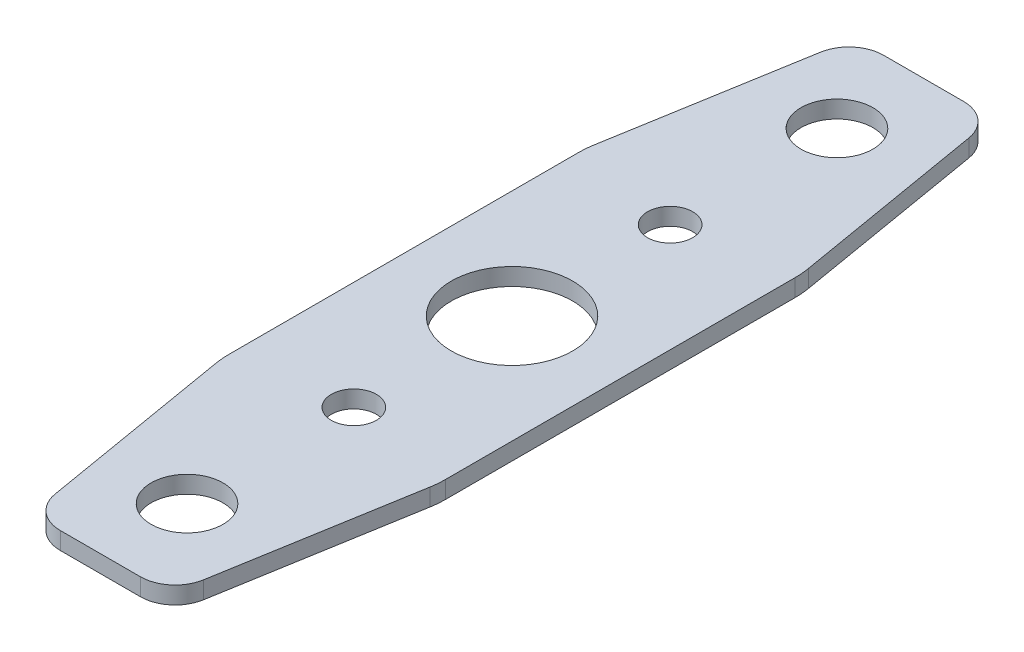
ISO-10303-21;
HEADER;
FILE_DESCRIPTION(('STEP AP214'),'2;1');
FILE_NAME('part.step','',(''),(''),'','','');
FILE_SCHEMA(('AUTOMOTIVE_DESIGN { 1 0 10303 214 1 1 1 1 }'));
ENDSEC;
DATA;
#1=APPLICATION_CONTEXT('core data for automotive mechanical design processes');
#2=APPLICATION_PROTOCOL_DEFINITION('international standard','automotive_design',2000,#1);
#3=PRODUCT_CONTEXT('',#1,'mechanical');
#4=PRODUCT('Part','Part','',(#3));
#5=PRODUCT_RELATED_PRODUCT_CATEGORY('part','',(#4));
#6=PRODUCT_DEFINITION_FORMATION('','',#4);
#7=PRODUCT_DEFINITION_CONTEXT('part definition',#1,'design');
#8=PRODUCT_DEFINITION('design','',#6,#7);
#9=PRODUCT_DEFINITION_SHAPE('','',#8);
#10=(LENGTH_UNIT() NAMED_UNIT(*) SI_UNIT(.MILLI.,.METRE.));
#11=(NAMED_UNIT(*) PLANE_ANGLE_UNIT() SI_UNIT($,.RADIAN.));
#12=(NAMED_UNIT(*) SI_UNIT($,.STERADIAN.) SOLID_ANGLE_UNIT());
#13=UNCERTAINTY_MEASURE_WITH_UNIT(LENGTH_MEASURE(1.E-05),#10,'distance_accuracy_value','');
#14=(GEOMETRIC_REPRESENTATION_CONTEXT(3) GLOBAL_UNCERTAINTY_ASSIGNED_CONTEXT((#13)) GLOBAL_UNIT_ASSIGNED_CONTEXT((#10,
#11,#12)) REPRESENTATION_CONTEXT('',''));
#15=CARTESIAN_POINT('',(0.,0.,0.));
#16=DIRECTION('',(0.,0.,1.));
#17=DIRECTION('',(1.,0.,0.));
#18=AXIS2_PLACEMENT_3D('',#15,#16,#17);
#19=CARTESIAN_POINT('',(4.62198337940662,2.,43.5));
#20=DIRECTION('',(0.,-1.,0.));
#21=DIRECTION('',(0.,0.,-1.));
#22=AXIS2_PLACEMENT_3D('',#19,#20,#21);
#23=CYLINDRICAL_SURFACE('',#22,4.);
#24=CARTESIAN_POINT('',(4.62198337940662,0.,43.5));
#25=DIRECTION('',(0.,1.,0.));
#26=DIRECTION('',(0.,0.,1.));
#27=AXIS2_PLACEMENT_3D('',#24,#25,#26);
#28=CIRCLE('',#27,4.);
#29=CARTESIAN_POINT('',(8.56552963796953,0.,44.1696587986239));
#30=VERTEX_POINT('',#29);
#31=CARTESIAN_POINT('',(4.62198337940661,0.,47.5));
#32=VERTEX_POINT('',#31);
#33=EDGE_CURVE('E156',#30,#32,#28,.F.);
#34=ORIENTED_EDGE('',*,*,#33,.F.);
#35=DIRECTION('',(0.,-1.,0.));
#36=VECTOR('',#35,1.);
#37=CARTESIAN_POINT('',(8.56552963796953,2.,44.1696587986239));
#38=LINE('',#37,#36);
#39=CARTESIAN_POINT('',(8.56552963796953,2.,44.1696587986239));
#40=VERTEX_POINT('',#39);
#41=EDGE_CURVE('E151',#40,#30,#38,.T.);
#42=ORIENTED_EDGE('',*,*,#41,.F.);
#43=CARTESIAN_POINT('',(4.62198337940662,2.,43.5));
#44=DIRECTION('',(0.,1.,0.));
#45=DIRECTION('',(0.,0.,1.));
#46=AXIS2_PLACEMENT_3D('',#43,#44,#45);
#47=CIRCLE('',#46,4.);
#48=CARTESIAN_POINT('',(4.62198337940661,2.,47.5));
#49=VERTEX_POINT('',#48);
#50=EDGE_CURVE('E154',#40,#49,#47,.F.);
#51=ORIENTED_EDGE('',*,*,#50,.T.);
#52=DIRECTION('',(0.,-1.,0.));
#53=VECTOR('',#52,1.);
#54=CARTESIAN_POINT('',(4.62198337940661,2.,47.5));
#55=LINE('',#54,#53);
#56=EDGE_CURVE('E218',#49,#32,#55,.T.);
#57=ORIENTED_EDGE('',*,*,#56,.T.);
#58=EDGE_LOOP('',(#34,#42,#51,#57));
#59=FACE_BOUND('',#58,.T.);
#60=ADVANCED_FACE('F35',(#59),#23,.T.);
#61=CARTESIAN_POINT('',(15.6157439446367,2.,2.65173010380624));
#62=DIRECTION('',(-0.98588656464073,0.,-0.167414699655973));
#63=DIRECTION('',(-0.167414699655973,0.,0.98588656464073));
#64=AXIS2_PLACEMENT_3D('',#61,#62,#63);
#65=PLANE('',#64);
#66=DIRECTION('',(0.167414699655973,0.,-0.98588656464073));
#67=VECTOR('',#66,1.);
#68=CARTESIAN_POINT('',(15.6157439446367,0.,2.65173010380624));
#69=LINE('',#68,#67);
#70=CARTESIAN_POINT('',(12.3588656464073,0.,21.8311245267126));
#71=VERTEX_POINT('',#70);
#72=EDGE_CURVE('E220',#30,#71,#69,.T.);
#73=ORIENTED_EDGE('',*,*,#72,.T.);
#74=DIRECTION('',(0.,-1.,0.));
#75=VECTOR('',#74,1.);
#76=CARTESIAN_POINT('',(12.3588656464073,2.,21.8311245267126));
#77=LINE('',#76,#75);
#78=CARTESIAN_POINT('',(12.3588656464073,2.,21.8311245267126));
#79=VERTEX_POINT('',#78);
#80=EDGE_CURVE('E43',#71,#79,#77,.F.);
#81=ORIENTED_EDGE('',*,*,#80,.T.);
#82=DIRECTION('',(0.167414699655973,0.,-0.98588656464073));
#83=VECTOR('',#82,1.);
#84=CARTESIAN_POINT('',(15.6157439446367,2.,2.65173010380624));
#85=LINE('',#84,#83);
#86=EDGE_CURVE('E164',#40,#79,#85,.T.);
#87=ORIENTED_EDGE('',*,*,#86,.F.);
#88=ORIENTED_EDGE('',*,*,#41,.T.);
#89=EDGE_LOOP('',(#73,#81,#87,#88));
#90=FACE_BOUND('',#89,.T.);
#91=ADVANCED_FACE('F165',(#90),#65,.F.);
#92=CARTESIAN_POINT('',(12.5,2.,0.));
#93=DIRECTION('',(-1.,0.,0.));
#94=DIRECTION('',(0.,0.,1.));
#95=AXIS2_PLACEMENT_3D('',#92,#93,#94);
#96=PLANE('',#95);
#97=DIRECTION('',(0.,0.,-1.));
#98=VECTOR('',#97,1.);
#99=CARTESIAN_POINT('',(12.5,2.,0.));
#100=LINE('',#99,#98);
#101=CARTESIAN_POINT('',(12.5,2.,20.1569775301528));
#102=VERTEX_POINT('',#101);
#103=CARTESIAN_POINT('',(12.5,2.,-20.1569775301528));
#104=VERTEX_POINT('',#103);
#105=EDGE_CURVE('E168',#102,#104,#100,.T.);
#106=ORIENTED_EDGE('',*,*,#105,.F.);
#107=DIRECTION('',(0.,-1.,0.));
#108=VECTOR('',#107,1.);
#109=CARTESIAN_POINT('',(12.5,2.,20.1569775301528));
#110=LINE('',#109,#108);
#111=CARTESIAN_POINT('',(12.5,0.,20.1569775301528));
#112=VERTEX_POINT('',#111);
#113=EDGE_CURVE('E300',#102,#112,#110,.T.);
#114=ORIENTED_EDGE('',*,*,#113,.T.);
#115=DIRECTION('',(0.,0.,-1.));
#116=VECTOR('',#115,1.);
#117=CARTESIAN_POINT('',(12.5,0.,0.));
#118=LINE('',#117,#116);
#119=CARTESIAN_POINT('',(12.5,0.,-20.1569775301528));
#120=VERTEX_POINT('',#119);
#121=EDGE_CURVE('E222',#112,#120,#118,.T.);
#122=ORIENTED_EDGE('',*,*,#121,.T.);
#123=DIRECTION('',(0.,-1.,0.));
#124=VECTOR('',#123,1.);
#125=CARTESIAN_POINT('',(12.5,2.,-20.1569775301528));
#126=LINE('',#125,#124);
#127=EDGE_CURVE('E298',#120,#104,#126,.F.);
#128=ORIENTED_EDGE('',*,*,#127,.T.);
#129=EDGE_LOOP('',(#106,#114,#122,#128));
#130=FACE_BOUND('',#129,.T.);
#131=ADVANCED_FACE('F306',(#130),#96,.F.);
#132=CARTESIAN_POINT('',(15.6157439446367,2.,-2.65173010380623));
#133=DIRECTION('',(0.98588656464073,0.,-0.167414699655973));
#134=DIRECTION('',(-0.167414699655973,0.,-0.98588656464073));
#135=AXIS2_PLACEMENT_3D('',#132,#133,#134);
#136=PLANE('',#135);
#137=DIRECTION('',(0.167414699655973,0.,0.98588656464073));
#138=VECTOR('',#137,1.);
#139=CARTESIAN_POINT('',(15.6157439446367,2.,-2.65173010380623));
#140=LINE('',#139,#138);
#141=CARTESIAN_POINT('',(8.56552963796953,2.,-44.1696587986239));
#142=VERTEX_POINT('',#141);
#143=CARTESIAN_POINT('',(12.3588656464073,2.,-21.8311245267126));
#144=VERTEX_POINT('',#143);
#145=EDGE_CURVE('E183',#142,#144,#140,.T.);
#146=ORIENTED_EDGE('',*,*,#145,.T.);
#147=DIRECTION('',(0.,-1.,0.));
#148=VECTOR('',#147,1.);
#149=CARTESIAN_POINT('',(12.3588656464073,0.,-21.8311245267126));
#150=LINE('',#149,#148);
#151=CARTESIAN_POINT('',(12.3588656464073,0.,-21.8311245267126));
#152=VERTEX_POINT('',#151);
#153=EDGE_CURVE('E11',#144,#152,#150,.T.);
#154=ORIENTED_EDGE('',*,*,#153,.T.);
#155=DIRECTION('',(0.167414699655973,0.,0.98588656464073));
#156=VECTOR('',#155,1.);
#157=CARTESIAN_POINT('',(15.6157439446367,0.,-2.65173010380623));
#158=LINE('',#157,#156);
#159=CARTESIAN_POINT('',(8.56552963796953,0.,-44.1696587986239));
#160=VERTEX_POINT('',#159);
#161=EDGE_CURVE('E225',#160,#152,#158,.T.);
#162=ORIENTED_EDGE('',*,*,#161,.F.);
#163=DIRECTION('',(0.,-1.,0.));
#164=VECTOR('',#163,1.);
#165=CARTESIAN_POINT('',(8.56552963796953,2.,-44.1696587986239));
#166=LINE('',#165,#164);
#167=EDGE_CURVE('E161',#142,#160,#166,.T.);
#168=ORIENTED_EDGE('',*,*,#167,.F.);
#169=EDGE_LOOP('',(#146,#154,#162,#168));
#170=FACE_BOUND('',#169,.T.);
#171=ADVANCED_FACE('F317',(#170),#136,.T.);
#172=CARTESIAN_POINT('',(4.62198337940662,2.,-43.5));
#173=DIRECTION('',(0.,-1.,0.));
#174=DIRECTION('',(0.,0.,-1.));
#175=AXIS2_PLACEMENT_3D('',#172,#173,#174);
#176=CYLINDRICAL_SURFACE('',#175,4.);
#177=CARTESIAN_POINT('',(4.62198337940662,0.,-43.5));
#178=DIRECTION('',(0.,1.,0.));
#179=DIRECTION('',(0.,0.,1.));
#180=AXIS2_PLACEMENT_3D('',#177,#178,#179);
#181=CIRCLE('',#180,4.);
#182=CARTESIAN_POINT('',(4.62198337940661,0.,-47.5));
#183=VERTEX_POINT('',#182);
#184=EDGE_CURVE('E228',#160,#183,#181,.T.);
#185=ORIENTED_EDGE('',*,*,#184,.T.);
#186=DIRECTION('',(0.,-1.,0.));
#187=VECTOR('',#186,1.);
#188=CARTESIAN_POINT('',(4.62198337940661,2.,-47.5));
#189=LINE('',#188,#187);
#190=CARTESIAN_POINT('',(4.62198337940661,2.,-47.5));
#191=VERTEX_POINT('',#190);
#192=EDGE_CURVE('E272',#191,#183,#189,.T.);
#193=ORIENTED_EDGE('',*,*,#192,.F.);
#194=CARTESIAN_POINT('',(4.62198337940662,2.,-43.5));
#195=DIRECTION('',(0.,1.,0.));
#196=DIRECTION('',(0.,0.,1.));
#197=AXIS2_PLACEMENT_3D('',#194,#195,#196);
#198=CIRCLE('',#197,4.);
#199=EDGE_CURVE('E185',#142,#191,#198,.T.);
#200=ORIENTED_EDGE('',*,*,#199,.F.);
#201=ORIENTED_EDGE('',*,*,#167,.T.);
#202=EDGE_LOOP('',(#185,#193,#200,#201));
#203=FACE_BOUND('',#202,.T.);
#204=ADVANCED_FACE('F323',(#203),#176,.T.);
#205=CARTESIAN_POINT('',(0.,2.,-47.5));
#206=DIRECTION('',(0.,0.,-1.));
#207=DIRECTION('',(-1.,0.,0.));
#208=AXIS2_PLACEMENT_3D('',#205,#206,#207);
#209=PLANE('',#208);
#210=DIRECTION('',(1.,0.,0.));
#211=VECTOR('',#210,1.);
#212=CARTESIAN_POINT('',(0.,0.,-47.5));
#213=LINE('',#212,#211);
#214=CARTESIAN_POINT('',(-4.62198337940661,0.,-47.5));
#215=VERTEX_POINT('',#214);
#216=EDGE_CURVE('E231',#215,#183,#213,.T.);
#217=ORIENTED_EDGE('',*,*,#216,.F.);
#218=DIRECTION('',(0.,-1.,0.));
#219=VECTOR('',#218,1.);
#220=CARTESIAN_POINT('',(-4.62198337940661,2.,-47.5));
#221=LINE('',#220,#219);
#222=CARTESIAN_POINT('',(-4.62198337940661,2.,-47.5));
#223=VERTEX_POINT('',#222);
#224=EDGE_CURVE('E270',#223,#215,#221,.T.);
#225=ORIENTED_EDGE('',*,*,#224,.F.);
#226=DIRECTION('',(1.,0.,0.));
#227=VECTOR('',#226,1.);
#228=CARTESIAN_POINT('',(0.,2.,-47.5));
#229=LINE('',#228,#227);
#230=EDGE_CURVE('E187',#223,#191,#229,.T.);
#231=ORIENTED_EDGE('',*,*,#230,.T.);
#232=ORIENTED_EDGE('',*,*,#192,.T.);
#233=EDGE_LOOP('',(#217,#225,#231,#232));
#234=FACE_BOUND('',#233,.T.);
#235=ADVANCED_FACE('F326',(#234),#209,.T.);
#236=CARTESIAN_POINT('',(-4.62198337940661,2.,-43.5));
#237=DIRECTION('',(0.,-1.,0.));
#238=DIRECTION('',(0.,0.,-1.));
#239=AXIS2_PLACEMENT_3D('',#236,#237,#238);
#240=CYLINDRICAL_SURFACE('',#239,4.);
#241=CARTESIAN_POINT('',(-4.62198337940661,0.,-43.5));
#242=DIRECTION('',(0.,1.,0.));
#243=DIRECTION('',(0.,0.,1.));
#244=AXIS2_PLACEMENT_3D('',#241,#242,#243);
#245=CIRCLE('',#244,4.);
#246=CARTESIAN_POINT('',(-8.56552963796953,0.,-44.1696587986239));
#247=VERTEX_POINT('',#246);
#248=EDGE_CURVE('E234',#247,#215,#245,.F.);
#249=ORIENTED_EDGE('',*,*,#248,.F.);
#250=DIRECTION('',(0.,-1.,0.));
#251=VECTOR('',#250,1.);
#252=CARTESIAN_POINT('',(-8.56552963796953,2.,-44.1696587986239));
#253=LINE('',#252,#251);
#254=CARTESIAN_POINT('',(-8.56552963796953,2.,-44.1696587986239));
#255=VERTEX_POINT('',#254);
#256=EDGE_CURVE('E268',#255,#247,#253,.T.);
#257=ORIENTED_EDGE('',*,*,#256,.F.);
#258=CARTESIAN_POINT('',(-4.62198337940661,2.,-43.5));
#259=DIRECTION('',(0.,1.,0.));
#260=DIRECTION('',(0.,0.,1.));
#261=AXIS2_PLACEMENT_3D('',#258,#259,#260);
#262=CIRCLE('',#261,4.);
#263=EDGE_CURVE('E190',#255,#223,#262,.F.);
#264=ORIENTED_EDGE('',*,*,#263,.T.);
#265=ORIENTED_EDGE('',*,*,#224,.T.);
#266=EDGE_LOOP('',(#249,#257,#264,#265));
#267=FACE_BOUND('',#266,.T.);
#268=ADVANCED_FACE('F329',(#267),#240,.T.);
#269=CARTESIAN_POINT('',(-15.6157439446367,2.,-2.65173010380622));
#270=DIRECTION('',(0.98588656464073,0.,0.167414699655973));
#271=DIRECTION('',(0.167414699655973,0.,-0.98588656464073));
#272=AXIS2_PLACEMENT_3D('',#269,#270,#271);
#273=PLANE('',#272);
#274=DIRECTION('',(-0.167414699655973,0.,0.98588656464073));
#275=VECTOR('',#274,1.);
#276=CARTESIAN_POINT('',(-15.6157439446367,0.,-2.65173010380622));
#277=LINE('',#276,#275);
#278=CARTESIAN_POINT('',(-12.3588656464073,0.,-21.8311245267126));
#279=VERTEX_POINT('',#278);
#280=EDGE_CURVE('E237',#247,#279,#277,.T.);
#281=ORIENTED_EDGE('',*,*,#280,.T.);
#282=DIRECTION('',(0.,-1.,0.));
#283=VECTOR('',#282,1.);
#284=CARTESIAN_POINT('',(-12.3588656464073,2.,-21.8311245267126));
#285=LINE('',#284,#283);
#286=CARTESIAN_POINT('',(-12.3588656464073,2.,-21.8311245267126));
#287=VERTEX_POINT('',#286);
#288=EDGE_CURVE('E287',#279,#287,#285,.F.);
#289=ORIENTED_EDGE('',*,*,#288,.T.);
#290=DIRECTION('',(-0.167414699655973,0.,0.98588656464073));
#291=VECTOR('',#290,1.);
#292=CARTESIAN_POINT('',(-15.6157439446367,2.,-2.65173010380622));
#293=LINE('',#292,#291);
#294=EDGE_CURVE('E193',#255,#287,#293,.T.);
#295=ORIENTED_EDGE('',*,*,#294,.F.);
#296=ORIENTED_EDGE('',*,*,#256,.T.);
#297=EDGE_LOOP('',(#281,#289,#295,#296));
#298=FACE_BOUND('',#297,.T.);
#299=ADVANCED_FACE('F409',(#298),#273,.F.);
#300=CARTESIAN_POINT('',(-12.5,2.,0.));
#301=DIRECTION('',(-1.,0.,0.));
#302=DIRECTION('',(0.,0.,1.));
#303=AXIS2_PLACEMENT_3D('',#300,#301,#302);
#304=PLANE('',#303);
#305=DIRECTION('',(0.,0.,-1.));
#306=VECTOR('',#305,1.);
#307=CARTESIAN_POINT('',(-12.5,2.,0.));
#308=LINE('',#307,#306);
#309=CARTESIAN_POINT('',(-12.5,2.,20.1569775301528));
#310=VERTEX_POINT('',#309);
#311=CARTESIAN_POINT('',(-12.5,2.,-20.1569775301528));
#312=VERTEX_POINT('',#311);
#313=EDGE_CURVE('E195',#310,#312,#308,.T.);
#314=ORIENTED_EDGE('',*,*,#313,.T.);
#315=DIRECTION('',(0.,-1.,0.));
#316=VECTOR('',#315,1.);
#317=CARTESIAN_POINT('',(-12.5,0.,-20.1569775301528));
#318=LINE('',#317,#316);
#319=CARTESIAN_POINT('',(-12.5,0.,-20.1569775301528));
#320=VERTEX_POINT('',#319);
#321=EDGE_CURVE('E276',#312,#320,#318,.T.);
#322=ORIENTED_EDGE('',*,*,#321,.T.);
#323=DIRECTION('',(0.,0.,-1.));
#324=VECTOR('',#323,1.);
#325=CARTESIAN_POINT('',(-12.5,0.,0.));
#326=LINE('',#325,#324);
#327=CARTESIAN_POINT('',(-12.5,0.,20.1569775301528));
#328=VERTEX_POINT('',#327);
#329=EDGE_CURVE('E240',#328,#320,#326,.T.);
#330=ORIENTED_EDGE('',*,*,#329,.F.);
#331=DIRECTION('',(0.,-1.,0.));
#332=VECTOR('',#331,1.);
#333=CARTESIAN_POINT('',(-12.5,2.,20.1569775301528));
#334=LINE('',#333,#332);
#335=EDGE_CURVE('E160',#328,#310,#334,.F.);
#336=ORIENTED_EDGE('',*,*,#335,.T.);
#337=EDGE_LOOP('',(#314,#322,#330,#336));
#338=FACE_BOUND('',#337,.T.);
#339=ADVANCED_FACE('F339',(#338),#304,.T.);
#340=CARTESIAN_POINT('',(-15.6157439446367,2.,2.65173010380623));
#341=DIRECTION('',(-0.98588656464073,0.,0.167414699655973));
#342=DIRECTION('',(0.167414699655973,0.,0.98588656464073));
#343=AXIS2_PLACEMENT_3D('',#340,#341,#342);
#344=PLANE('',#343);
#345=DIRECTION('',(-0.167414699655973,0.,-0.98588656464073));
#346=VECTOR('',#345,1.);
#347=CARTESIAN_POINT('',(-15.6157439446367,2.,2.65173010380623));
#348=LINE('',#347,#346);
#349=CARTESIAN_POINT('',(-8.56552963796951,2.,44.1696587986239));
#350=VERTEX_POINT('',#349);
#351=CARTESIAN_POINT('',(-12.3588656464073,2.,21.8311245267126));
#352=VERTEX_POINT('',#351);
#353=EDGE_CURVE('E198',#350,#352,#348,.T.);
#354=ORIENTED_EDGE('',*,*,#353,.T.);
#355=DIRECTION('',(0.,-1.,0.));
#356=VECTOR('',#355,1.);
#357=CARTESIAN_POINT('',(-12.3588656464073,2.,21.8311245267126));
#358=LINE('',#357,#356);
#359=CARTESIAN_POINT('',(-12.3588656464073,0.,21.8311245267126));
#360=VERTEX_POINT('',#359);
#361=EDGE_CURVE('E295',#352,#360,#358,.T.);
#362=ORIENTED_EDGE('',*,*,#361,.T.);
#363=DIRECTION('',(-0.167414699655973,0.,-0.98588656464073));
#364=VECTOR('',#363,1.);
#365=CARTESIAN_POINT('',(-15.6157439446367,0.,2.65173010380623));
#366=LINE('',#365,#364);
#367=CARTESIAN_POINT('',(-8.56552963796951,0.,44.1696587986239));
#368=VERTEX_POINT('',#367);
#369=EDGE_CURVE('E243',#368,#360,#366,.T.);
#370=ORIENTED_EDGE('',*,*,#369,.F.);
#371=DIRECTION('',(0.,-1.,0.));
#372=VECTOR('',#371,1.);
#373=CARTESIAN_POINT('',(-8.56552963796951,2.,44.1696587986239));
#374=LINE('',#373,#372);
#375=EDGE_CURVE('E266',#350,#368,#374,.T.);
#376=ORIENTED_EDGE('',*,*,#375,.F.);
#377=EDGE_LOOP('',(#354,#362,#370,#376));
#378=FACE_BOUND('',#377,.T.);
#379=ADVANCED_FACE('F348',(#378),#344,.T.);
#380=CARTESIAN_POINT('',(-4.62198337940659,2.,43.5));
#381=DIRECTION('',(0.,-1.,0.));
#382=DIRECTION('',(0.,0.,-1.));
#383=AXIS2_PLACEMENT_3D('',#380,#381,#382);
#384=CYLINDRICAL_SURFACE('',#383,4.);
#385=CARTESIAN_POINT('',(-4.62198337940659,0.,43.5));
#386=DIRECTION('',(0.,1.,0.));
#387=DIRECTION('',(0.,0.,1.));
#388=AXIS2_PLACEMENT_3D('',#385,#386,#387);
#389=CIRCLE('',#388,4.);
#390=CARTESIAN_POINT('',(-4.62198337940659,0.,47.5));
#391=VERTEX_POINT('',#390);
#392=EDGE_CURVE('E246',#368,#391,#389,.T.);
#393=ORIENTED_EDGE('',*,*,#392,.T.);
#394=DIRECTION('',(0.,-1.,0.));
#395=VECTOR('',#394,1.);
#396=CARTESIAN_POINT('',(-4.62198337940659,2.,47.5));
#397=LINE('',#396,#395);
#398=CARTESIAN_POINT('',(-4.62198337940659,2.,47.5));
#399=VERTEX_POINT('',#398);
#400=EDGE_CURVE('E263',#399,#391,#397,.T.);
#401=ORIENTED_EDGE('',*,*,#400,.F.);
#402=CARTESIAN_POINT('',(-4.62198337940659,2.,43.5));
#403=DIRECTION('',(0.,1.,0.));
#404=DIRECTION('',(0.,0.,1.));
#405=AXIS2_PLACEMENT_3D('',#402,#403,#404);
#406=CIRCLE('',#405,4.);
#407=EDGE_CURVE('E200',#350,#399,#406,.T.);
#408=ORIENTED_EDGE('',*,*,#407,.F.);
#409=ORIENTED_EDGE('',*,*,#375,.T.);
#410=EDGE_LOOP('',(#393,#401,#408,#409));
#411=FACE_BOUND('',#410,.T.);
#412=ADVANCED_FACE('F352',(#411),#384,.T.);
#413=CARTESIAN_POINT('',(0.,2.,18.25));
#414=DIRECTION('',(0.,-1.,0.));
#415=DIRECTION('',(0.,0.,-1.));
#416=AXIS2_PLACEMENT_3D('',#413,#414,#415);
#417=CYLINDRICAL_SURFACE('',#416,2.6);
#418=CARTESIAN_POINT('',(0.,2.,18.25));
#419=DIRECTION('',(0.,1.,0.));
#420=DIRECTION('',(0.,0.,1.));
#421=AXIS2_PLACEMENT_3D('',#418,#419,#420);
#422=CIRCLE('',#421,2.6);
#423=CARTESIAN_POINT('',(0.,2.,20.85));
#424=VERTEX_POINT('',#423);
#425=EDGE_CURVE('E212',#424,#424,#422,.F.);
#426=ORIENTED_EDGE('',*,*,#425,.F.);
#427=EDGE_LOOP('',(#426));
#428=FACE_BOUND('',#427,.T.);
#429=CARTESIAN_POINT('',(0.,0.,18.25));
#430=DIRECTION('',(0.,1.,0.));
#431=DIRECTION('',(0.,0.,1.));
#432=AXIS2_PLACEMENT_3D('',#429,#430,#431);
#433=CIRCLE('',#432,2.6);
#434=CARTESIAN_POINT('',(0.,0.,20.85));
#435=VERTEX_POINT('',#434);
#436=EDGE_CURVE('E179',#435,#435,#433,.F.);
#437=ORIENTED_EDGE('',*,*,#436,.T.);
#438=EDGE_LOOP('',(#437));
#439=FACE_BOUND('',#438,.T.);
#440=ADVANCED_FACE('F385',(#428,#439),#417,.F.);
#441=CARTESIAN_POINT('',(0.,2.,-18.25));
#442=DIRECTION('',(0.,-1.,0.));
#443=DIRECTION('',(0.,0.,-1.));
#444=AXIS2_PLACEMENT_3D('',#441,#442,#443);
#445=CYLINDRICAL_SURFACE('',#444,2.6);
#446=CARTESIAN_POINT('',(0.,2.,-18.25));
#447=DIRECTION('',(0.,1.,0.));
#448=DIRECTION('',(0.,0.,1.));
#449=AXIS2_PLACEMENT_3D('',#446,#447,#448);
#450=CIRCLE('',#449,2.6);
#451=CARTESIAN_POINT('',(0.,2.,-15.65));
#452=VERTEX_POINT('',#451);
#453=EDGE_CURVE('E209',#452,#452,#450,.T.);
#454=ORIENTED_EDGE('',*,*,#453,.T.);
#455=EDGE_LOOP('',(#454));
#456=FACE_BOUND('',#455,.T.);
#457=CARTESIAN_POINT('',(0.,0.,-18.25));
#458=DIRECTION('',(0.,1.,0.));
#459=DIRECTION('',(0.,0.,1.));
#460=AXIS2_PLACEMENT_3D('',#457,#458,#459);
#461=CIRCLE('',#460,2.6);
#462=CARTESIAN_POINT('',(0.,0.,-15.65));
#463=VERTEX_POINT('',#462);
#464=EDGE_CURVE('E257',#463,#463,#461,.T.);
#465=ORIENTED_EDGE('',*,*,#464,.F.);
#466=EDGE_LOOP('',(#465));
#467=FACE_BOUND('',#466,.T.);
#468=ADVANCED_FACE('F388',(#456,#467),#445,.F.);
#469=CARTESIAN_POINT('',(0.,2.,0.));
#470=DIRECTION('',(0.,-1.,0.));
#471=DIRECTION('',(0.,0.,-1.));
#472=AXIS2_PLACEMENT_3D('',#469,#470,#471);
#473=CYLINDRICAL_SURFACE('',#472,7.);
#474=CARTESIAN_POINT('',(0.,2.,0.));
#475=DIRECTION('',(0.,1.,0.));
#476=DIRECTION('',(0.,0.,1.));
#477=AXIS2_PLACEMENT_3D('',#474,#475,#476);
#478=CIRCLE('',#477,7.);
#479=CARTESIAN_POINT('',(0.,2.,7.));
#480=VERTEX_POINT('',#479);
#481=EDGE_CURVE('E206',#480,#480,#478,.T.);
#482=ORIENTED_EDGE('',*,*,#481,.T.);
#483=EDGE_LOOP('',(#482));
#484=FACE_BOUND('',#483,.T.);
#485=CARTESIAN_POINT('',(0.,0.,0.));
#486=DIRECTION('',(0.,1.,0.));
#487=DIRECTION('',(0.,0.,1.));
#488=AXIS2_PLACEMENT_3D('',#485,#486,#487);
#489=CIRCLE('',#488,7.);
#490=CARTESIAN_POINT('',(0.,0.,7.));
#491=VERTEX_POINT('',#490);
#492=EDGE_CURVE('E254',#491,#491,#489,.T.);
#493=ORIENTED_EDGE('',*,*,#492,.F.);
#494=EDGE_LOOP('',(#493));
#495=FACE_BOUND('',#494,.T.);
#496=ADVANCED_FACE('F392',(#484,#495),#473,.F.);
#497=CARTESIAN_POINT('',(0.,2.,37.5));
#498=DIRECTION('',(0.,-1.,0.));
#499=DIRECTION('',(0.,0.,-1.));
#500=AXIS2_PLACEMENT_3D('',#497,#498,#499);
#501=CYLINDRICAL_SURFACE('',#500,4.15);
#502=CARTESIAN_POINT('',(0.,2.,37.5));
#503=DIRECTION('',(0.,1.,0.));
#504=DIRECTION('',(0.,0.,1.));
#505=AXIS2_PLACEMENT_3D('',#502,#503,#504);
#506=CIRCLE('',#505,4.15);
#507=CARTESIAN_POINT('',(0.,2.,41.65));
#508=VERTEX_POINT('',#507);
#509=EDGE_CURVE('E203',#508,#508,#506,.F.);
#510=ORIENTED_EDGE('',*,*,#509,.F.);
#511=EDGE_LOOP('',(#510));
#512=FACE_BOUND('',#511,.T.);
#513=CARTESIAN_POINT('',(0.,0.,37.5));
#514=DIRECTION('',(0.,1.,0.));
#515=DIRECTION('',(0.,0.,1.));
#516=AXIS2_PLACEMENT_3D('',#513,#514,#515);
#517=CIRCLE('',#516,4.15);
#518=CARTESIAN_POINT('',(0.,0.,41.65));
#519=VERTEX_POINT('',#518);
#520=EDGE_CURVE('E251',#519,#519,#517,.F.);
#521=ORIENTED_EDGE('',*,*,#520,.T.);
#522=EDGE_LOOP('',(#521));
#523=FACE_BOUND('',#522,.T.);
#524=ADVANCED_FACE('F396',(#512,#523),#501,.F.);
#525=CARTESIAN_POINT('',(0.,2.,47.5));
#526=DIRECTION('',(0.,0.,-1.));
#527=DIRECTION('',(-1.,0.,0.));
#528=AXIS2_PLACEMENT_3D('',#525,#526,#527);
#529=PLANE('',#528);
#530=DIRECTION('',(1.,0.,0.));
#531=VECTOR('',#530,1.);
#532=CARTESIAN_POINT('',(0.,0.,47.5));
#533=LINE('',#532,#531);
#534=EDGE_CURVE('E248',#391,#32,#533,.T.);
#535=ORIENTED_EDGE('',*,*,#534,.T.);
#536=ORIENTED_EDGE('',*,*,#56,.F.);
#537=DIRECTION('',(1.,0.,0.));
#538=VECTOR('',#537,1.);
#539=CARTESIAN_POINT('',(0.,2.,47.5));
#540=LINE('',#539,#538);
#541=EDGE_CURVE('E174',#399,#49,#540,.T.);
#542=ORIENTED_EDGE('',*,*,#541,.F.);
#543=ORIENTED_EDGE('',*,*,#400,.T.);
#544=EDGE_LOOP('',(#535,#536,#542,#543));
#545=FACE_BOUND('',#544,.T.);
#546=ADVANCED_FACE('F355',(#545),#529,.F.);
#547=CARTESIAN_POINT('',(0.,2.,-37.5));
#548=DIRECTION('',(0.,-1.,0.));
#549=DIRECTION('',(0.,0.,-1.));
#550=AXIS2_PLACEMENT_3D('',#547,#548,#549);
#551=CYLINDRICAL_SURFACE('',#550,4.15);
#552=CARTESIAN_POINT('',(0.,2.,-37.5));
#553=DIRECTION('',(0.,1.,0.));
#554=DIRECTION('',(0.,0.,1.));
#555=AXIS2_PLACEMENT_3D('',#552,#553,#554);
#556=CIRCLE('',#555,4.15);
#557=CARTESIAN_POINT('',(0.,2.,-33.35));
#558=VERTEX_POINT('',#557);
#559=EDGE_CURVE('E215',#558,#558,#556,.T.);
#560=ORIENTED_EDGE('',*,*,#559,.T.);
#561=EDGE_LOOP('',(#560));
#562=FACE_BOUND('',#561,.T.);
#563=CARTESIAN_POINT('',(0.,0.,-37.5));
#564=DIRECTION('',(0.,1.,0.));
#565=DIRECTION('',(0.,0.,1.));
#566=AXIS2_PLACEMENT_3D('',#563,#564,#565);
#567=CIRCLE('',#566,4.15);
#568=CARTESIAN_POINT('',(0.,0.,-33.35));
#569=VERTEX_POINT('',#568);
#570=EDGE_CURVE('E176',#569,#569,#567,.T.);
#571=ORIENTED_EDGE('',*,*,#570,.F.);
#572=EDGE_LOOP('',(#571));
#573=FACE_BOUND('',#572,.T.);
#574=ADVANCED_FACE('F379',(#562,#573),#551,.F.);
#575=CARTESIAN_POINT('',(0.,2.,0.));
#576=DIRECTION('',(0.,1.,0.));
#577=DIRECTION('',(0.,0.,1.));
#578=AXIS2_PLACEMENT_3D('',#575,#576,#577);
#579=PLANE('',#578);
#580=ORIENTED_EDGE('',*,*,#294,.T.);
#581=CARTESIAN_POINT('',(-2.49999999999999,2.,-20.1569775301528));
#582=DIRECTION('',(0.,1.,0.));
#583=DIRECTION('',(0.,0.,1.));
#584=AXIS2_PLACEMENT_3D('',#581,#582,#583);
#585=CIRCLE('',#584,10.);
#586=EDGE_CURVE('E293',#287,#312,#585,.T.);
#587=ORIENTED_EDGE('',*,*,#586,.T.);
#588=ORIENTED_EDGE('',*,*,#313,.F.);
#589=CARTESIAN_POINT('',(-2.49999999999999,2.,20.1569775301528));
#590=DIRECTION('',(0.,1.,0.));
#591=DIRECTION('',(0.,0.,1.));
#592=AXIS2_PLACEMENT_3D('',#589,#590,#591);
#593=CIRCLE('',#592,10.);
#594=EDGE_CURVE('E50',#310,#352,#593,.T.);
#595=ORIENTED_EDGE('',*,*,#594,.T.);
#596=ORIENTED_EDGE('',*,*,#353,.F.);
#597=ORIENTED_EDGE('',*,*,#407,.T.);
#598=ORIENTED_EDGE('',*,*,#541,.T.);
#599=ORIENTED_EDGE('',*,*,#50,.F.);
#600=ORIENTED_EDGE('',*,*,#86,.T.);
#601=CARTESIAN_POINT('',(2.50000000000001,2.,20.1569775301528));
#602=DIRECTION('',(0.,1.,0.));
#603=DIRECTION('',(0.,0.,1.));
#604=AXIS2_PLACEMENT_3D('',#601,#602,#603);
#605=CIRCLE('',#604,10.);
#606=EDGE_CURVE('E290',#79,#102,#605,.T.);
#607=ORIENTED_EDGE('',*,*,#606,.T.);
#608=ORIENTED_EDGE('',*,*,#105,.T.);
#609=CARTESIAN_POINT('',(2.50000000000001,2.,-20.1569775301528));
#610=DIRECTION('',(0.,1.,0.));
#611=DIRECTION('',(0.,0.,1.));
#612=AXIS2_PLACEMENT_3D('',#609,#610,#611);
#613=CIRCLE('',#612,10.);
#614=EDGE_CURVE('E57',#104,#144,#613,.T.);
#615=ORIENTED_EDGE('',*,*,#614,.T.);
#616=ORIENTED_EDGE('',*,*,#145,.F.);
#617=ORIENTED_EDGE('',*,*,#199,.T.);
#618=ORIENTED_EDGE('',*,*,#230,.F.);
#619=ORIENTED_EDGE('',*,*,#263,.F.);
#620=EDGE_LOOP('',(#580,#587,#588,#595,#596,#597,#598,#599,#600,#607,#608,#615,#616,#617,#618,#619));
#621=FACE_BOUND('',#620,.T.);
#622=ORIENTED_EDGE('',*,*,#509,.T.);
#623=EDGE_LOOP('',(#622));
#624=FACE_BOUND('',#623,.T.);
#625=ORIENTED_EDGE('',*,*,#481,.F.);
#626=EDGE_LOOP('',(#625));
#627=FACE_BOUND('',#626,.T.);
#628=ORIENTED_EDGE('',*,*,#453,.F.);
#629=EDGE_LOOP('',(#628));
#630=FACE_BOUND('',#629,.T.);
#631=ORIENTED_EDGE('',*,*,#425,.T.);
#632=EDGE_LOOP('',(#631));
#633=FACE_BOUND('',#632,.T.);
#634=ORIENTED_EDGE('',*,*,#559,.F.);
#635=EDGE_LOOP('',(#634));
#636=FACE_BOUND('',#635,.T.);
#637=ADVANCED_FACE('F171',(#621,#624,#627,#630,#633,#636),#579,.T.);
#638=CARTESIAN_POINT('',(0.,0.,0.));
#639=DIRECTION('',(0.,1.,0.));
#640=DIRECTION('',(0.,0.,1.));
#641=AXIS2_PLACEMENT_3D('',#638,#639,#640);
#642=PLANE('',#641);
#643=ORIENTED_EDGE('',*,*,#329,.T.);
#644=CARTESIAN_POINT('',(-2.49999999999999,0.,-20.1569775301528));
#645=DIRECTION('',(0.,1.,0.));
#646=DIRECTION('',(0.,0.,1.));
#647=AXIS2_PLACEMENT_3D('',#644,#645,#646);
#648=CIRCLE('',#647,10.);
#649=EDGE_CURVE('E285',#320,#279,#648,.F.);
#650=ORIENTED_EDGE('',*,*,#649,.T.);
#651=ORIENTED_EDGE('',*,*,#280,.F.);
#652=ORIENTED_EDGE('',*,*,#248,.T.);
#653=ORIENTED_EDGE('',*,*,#216,.T.);
#654=ORIENTED_EDGE('',*,*,#184,.F.);
#655=ORIENTED_EDGE('',*,*,#161,.T.);
#656=CARTESIAN_POINT('',(2.50000000000001,0.,-20.1569775301528));
#657=DIRECTION('',(0.,1.,0.));
#658=DIRECTION('',(0.,0.,1.));
#659=AXIS2_PLACEMENT_3D('',#656,#657,#658);
#660=CIRCLE('',#659,10.);
#661=EDGE_CURVE('E279',#152,#120,#660,.F.);
#662=ORIENTED_EDGE('',*,*,#661,.T.);
#663=ORIENTED_EDGE('',*,*,#121,.F.);
#664=CARTESIAN_POINT('',(2.50000000000001,0.,20.1569775301528));
#665=DIRECTION('',(0.,1.,0.));
#666=DIRECTION('',(0.,0.,1.));
#667=AXIS2_PLACEMENT_3D('',#664,#665,#666);
#668=CIRCLE('',#667,10.);
#669=EDGE_CURVE('E281',#112,#71,#668,.F.);
#670=ORIENTED_EDGE('',*,*,#669,.T.);
#671=ORIENTED_EDGE('',*,*,#72,.F.);
#672=ORIENTED_EDGE('',*,*,#33,.T.);
#673=ORIENTED_EDGE('',*,*,#534,.F.);
#674=ORIENTED_EDGE('',*,*,#392,.F.);
#675=ORIENTED_EDGE('',*,*,#369,.T.);
#676=CARTESIAN_POINT('',(-2.49999999999999,0.,20.1569775301528));
#677=DIRECTION('',(0.,1.,0.));
#678=DIRECTION('',(0.,0.,1.));
#679=AXIS2_PLACEMENT_3D('',#676,#677,#678);
#680=CIRCLE('',#679,10.);
#681=EDGE_CURVE('E283',#360,#328,#680,.F.);
#682=ORIENTED_EDGE('',*,*,#681,.T.);
#683=EDGE_LOOP('',(#643,#650,#651,#652,#653,#654,#655,#662,#663,#670,#671,#672,#673,#674,#675,#682));
#684=FACE_BOUND('',#683,.T.);
#685=ORIENTED_EDGE('',*,*,#520,.F.);
#686=EDGE_LOOP('',(#685));
#687=FACE_BOUND('',#686,.T.);
#688=ORIENTED_EDGE('',*,*,#492,.T.);
#689=EDGE_LOOP('',(#688));
#690=FACE_BOUND('',#689,.T.);
#691=ORIENTED_EDGE('',*,*,#464,.T.);
#692=EDGE_LOOP('',(#691));
#693=FACE_BOUND('',#692,.T.);
#694=ORIENTED_EDGE('',*,*,#436,.F.);
#695=EDGE_LOOP('',(#694));
#696=FACE_BOUND('',#695,.T.);
#697=ORIENTED_EDGE('',*,*,#570,.T.);
#698=EDGE_LOOP('',(#697));
#699=FACE_BOUND('',#698,.T.);
#700=ADVANCED_FACE('F310',(#684,#687,#690,#693,#696,#699),#642,.F.);
#701=CARTESIAN_POINT('',(-2.49999999999999,2.,-20.1569775301528));
#702=DIRECTION('',(0.,1.,0.));
#703=DIRECTION('',(0.,0.,1.));
#704=AXIS2_PLACEMENT_3D('',#701,#702,#703);
#705=CYLINDRICAL_SURFACE('',#704,10.);
#706=ORIENTED_EDGE('',*,*,#586,.F.);
#707=ORIENTED_EDGE('',*,*,#288,.F.);
#708=ORIENTED_EDGE('',*,*,#649,.F.);
#709=ORIENTED_EDGE('',*,*,#321,.F.);
#710=EDGE_LOOP('',(#706,#707,#708,#709));
#711=FACE_BOUND('',#710,.T.);
#712=ADVANCED_FACE('F336',(#711),#705,.T.);
#713=CARTESIAN_POINT('',(-2.49999999999999,2.,20.1569775301528));
#714=DIRECTION('',(0.,-1.,0.));
#715=DIRECTION('',(0.,0.,-1.));
#716=AXIS2_PLACEMENT_3D('',#713,#714,#715);
#717=CYLINDRICAL_SURFACE('',#716,10.);
#718=ORIENTED_EDGE('',*,*,#594,.F.);
#719=ORIENTED_EDGE('',*,*,#335,.F.);
#720=ORIENTED_EDGE('',*,*,#681,.F.);
#721=ORIENTED_EDGE('',*,*,#361,.F.);
#722=EDGE_LOOP('',(#718,#719,#720,#721));
#723=FACE_BOUND('',#722,.T.);
#724=ADVANCED_FACE('F346',(#723),#717,.T.);
#725=CARTESIAN_POINT('',(2.50000000000001,2.,20.1569775301528));
#726=DIRECTION('',(0.,-1.,0.));
#727=DIRECTION('',(0.,0.,-1.));
#728=AXIS2_PLACEMENT_3D('',#725,#726,#727);
#729=CYLINDRICAL_SURFACE('',#728,10.);
#730=ORIENTED_EDGE('',*,*,#606,.F.);
#731=ORIENTED_EDGE('',*,*,#80,.F.);
#732=ORIENTED_EDGE('',*,*,#669,.F.);
#733=ORIENTED_EDGE('',*,*,#113,.F.);
#734=EDGE_LOOP('',(#730,#731,#732,#733));
#735=FACE_BOUND('',#734,.T.);
#736=ADVANCED_FACE('F356',(#735),#729,.T.);
#737=CARTESIAN_POINT('',(2.50000000000001,2.,-20.1569775301528));
#738=DIRECTION('',(0.,1.,0.));
#739=DIRECTION('',(0.,0.,1.));
#740=AXIS2_PLACEMENT_3D('',#737,#738,#739);
#741=CYLINDRICAL_SURFACE('',#740,10.);
#742=ORIENTED_EDGE('',*,*,#614,.F.);
#743=ORIENTED_EDGE('',*,*,#127,.F.);
#744=ORIENTED_EDGE('',*,*,#661,.F.);
#745=ORIENTED_EDGE('',*,*,#153,.F.);
#746=EDGE_LOOP('',(#742,#743,#744,#745));
#747=FACE_BOUND('',#746,.T.);
#748=ADVANCED_FACE('F37',(#747),#741,.T.);
#749=CLOSED_SHELL('',(#60,#91,#131,#171,#204,#235,#268,#299,#339,#379,#412,#440,#468,#496,#524,
#546,#574,#637,#700,#712,#724,#736,#748));
#750=MANIFOLD_SOLID_BREP('B2',#749);
#751=ADVANCED_BREP_SHAPE_REPRESENTATION('',(#18,#750),#14);
#752=SHAPE_DEFINITION_REPRESENTATION(#9,#751);
ENDSEC;
END-ISO-10303-21;
